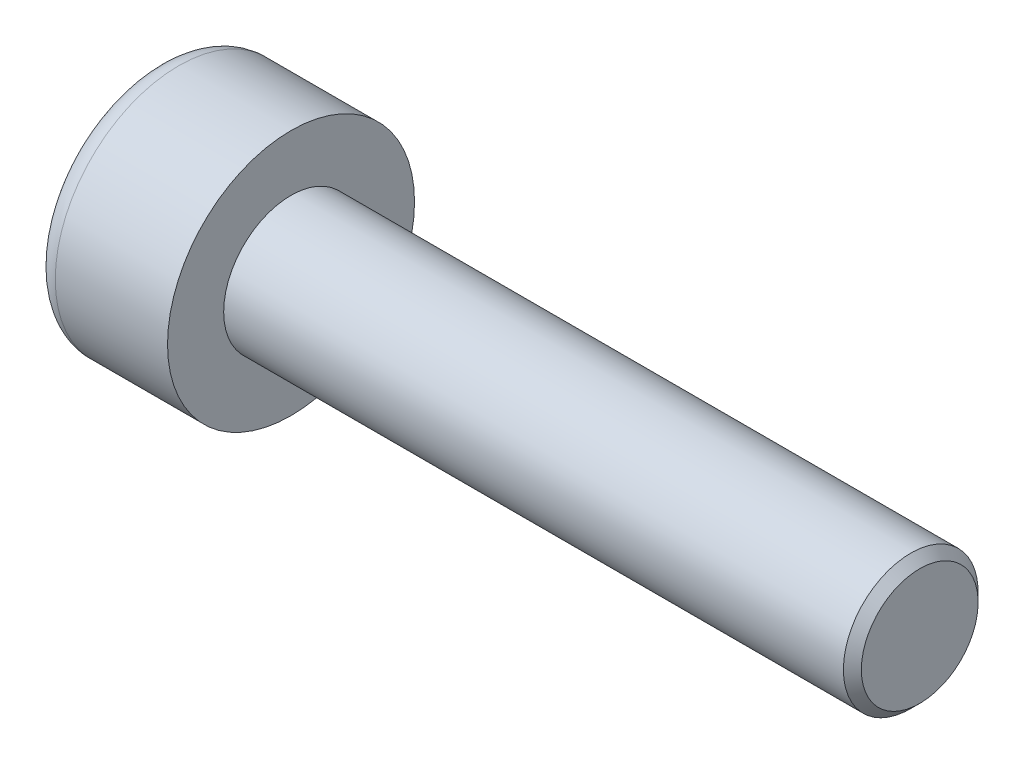
ISO-10303-21;
HEADER;
FILE_DESCRIPTION(('STEP AP214'),'2;1');
FILE_NAME('part.step','',(''),(''),'','','');
FILE_SCHEMA(('AUTOMOTIVE_DESIGN { 1 0 10303 214 1 1 1 1 }'));
ENDSEC;
DATA;
#1=APPLICATION_CONTEXT('core data for automotive mechanical design processes');
#2=APPLICATION_PROTOCOL_DEFINITION('international standard','automotive_design',2000,#1);
#3=PRODUCT_CONTEXT('',#1,'mechanical');
#4=PRODUCT('Part','Part','',(#3));
#5=PRODUCT_RELATED_PRODUCT_CATEGORY('part','',(#4));
#6=PRODUCT_DEFINITION_FORMATION('','',#4);
#7=PRODUCT_DEFINITION_CONTEXT('part definition',#1,'design');
#8=PRODUCT_DEFINITION('design','',#6,#7);
#9=PRODUCT_DEFINITION_SHAPE('','',#8);
#10=(LENGTH_UNIT() NAMED_UNIT(*) SI_UNIT(.MILLI.,.METRE.));
#11=(NAMED_UNIT(*) PLANE_ANGLE_UNIT() SI_UNIT($,.RADIAN.));
#12=(NAMED_UNIT(*) SI_UNIT($,.STERADIAN.) SOLID_ANGLE_UNIT());
#13=UNCERTAINTY_MEASURE_WITH_UNIT(LENGTH_MEASURE(1.E-05),#10,'distance_accuracy_value','');
#14=(GEOMETRIC_REPRESENTATION_CONTEXT(3) GLOBAL_UNCERTAINTY_ASSIGNED_CONTEXT((#13)) GLOBAL_UNIT_ASSIGNED_CONTEXT((#10,
#11,#12)) REPRESENTATION_CONTEXT('',''));
#15=CARTESIAN_POINT('',(0.,0.,0.));
#16=DIRECTION('',(0.,0.,1.));
#17=DIRECTION('',(1.,0.,0.));
#18=AXIS2_PLACEMENT_3D('',#15,#16,#17);
#19=CARTESIAN_POINT('',(0.,0.,0.));
#20=DIRECTION('',(1.,0.,0.));
#21=DIRECTION('',(0.,0.,-1.));
#22=AXIS2_PLACEMENT_3D('',#19,#20,#21);
#23=PLANE('',#22);
#24=DIRECTION('',(0.,0.866025403784439,0.5));
#25=VECTOR('',#24,1.);
#26=CARTESIAN_POINT('',(0.,-1.25,0.721687836487032));
#27=LINE('',#26,#25);
#28=CARTESIAN_POINT('',(0.,-1.25,0.721687836487032));
#29=VERTEX_POINT('',#28);
#30=CARTESIAN_POINT('',(0.,0.,1.44337567297406));
#31=VERTEX_POINT('',#30);
#32=EDGE_CURVE('E91',#29,#31,#27,.T.);
#33=ORIENTED_EDGE('',*,*,#32,.F.);
#34=DIRECTION('',(0.,0.,1.));
#35=VECTOR('',#34,1.);
#36=CARTESIAN_POINT('',(0.,-1.25,-0.721687836487033));
#37=LINE('',#36,#35);
#38=CARTESIAN_POINT('',(0.,-1.25,-0.721687836487033));
#39=VERTEX_POINT('',#38);
#40=EDGE_CURVE('E33',#39,#29,#37,.T.);
#41=ORIENTED_EDGE('',*,*,#40,.F.);
#42=DIRECTION('',(0.,-0.866025403784439,0.5));
#43=VECTOR('',#42,1.);
#44=CARTESIAN_POINT('',(0.,0.,-1.44337567297406));
#45=LINE('',#44,#43);
#46=CARTESIAN_POINT('',(0.,0.,-1.44337567297406));
#47=VERTEX_POINT('',#46);
#48=EDGE_CURVE('E106',#47,#39,#45,.T.);
#49=ORIENTED_EDGE('',*,*,#48,.F.);
#50=DIRECTION('',(0.,-0.866025403784439,-0.5));
#51=VECTOR('',#50,1.);
#52=CARTESIAN_POINT('',(0.,1.25,-0.721687836487033));
#53=LINE('',#52,#51);
#54=CARTESIAN_POINT('',(0.,1.25,-0.721687836487033));
#55=VERTEX_POINT('',#54);
#56=EDGE_CURVE('E100',#55,#47,#53,.T.);
#57=ORIENTED_EDGE('',*,*,#56,.F.);
#58=DIRECTION('',(0.,0.,-1.));
#59=VECTOR('',#58,1.);
#60=CARTESIAN_POINT('',(0.,1.25,0.721687836487032));
#61=LINE('',#60,#59);
#62=CARTESIAN_POINT('',(0.,1.25,0.721687836487032));
#63=VERTEX_POINT('',#62);
#64=EDGE_CURVE('E98',#63,#55,#61,.T.);
#65=ORIENTED_EDGE('',*,*,#64,.F.);
#66=DIRECTION('',(0.,0.866025403784439,-0.5));
#67=VECTOR('',#66,1.);
#68=CARTESIAN_POINT('',(0.,0.,1.44337567297406));
#69=LINE('',#68,#67);
#70=EDGE_CURVE('E84',#31,#63,#69,.T.);
#71=ORIENTED_EDGE('',*,*,#70,.F.);
#72=EDGE_LOOP('',(#33,#41,#49,#57,#65,#71));
#73=FACE_BOUND('',#72,.T.);
#74=CARTESIAN_POINT('',(0.,0.,0.));
#75=DIRECTION('',(-1.,0.,0.));
#76=DIRECTION('',(0.,0.,1.));
#77=AXIS2_PLACEMENT_3D('',#74,#75,#76);
#78=CIRCLE('',#77,2.25);
#79=CARTESIAN_POINT('',(0.,0.,2.25));
#80=VERTEX_POINT('',#79);
#81=EDGE_CURVE('E12',#80,#80,#78,.T.);
#82=ORIENTED_EDGE('',*,*,#81,.T.);
#83=EDGE_LOOP('',(#82));
#84=FACE_BOUND('',#83,.T.);
#85=ADVANCED_FACE('F19',(#73,#84),#23,.F.);
#86=CARTESIAN_POINT('',(0.5,0.,0.));
#87=DIRECTION('',(-1.,0.,0.));
#88=DIRECTION('',(0.,0.,1.));
#89=AXIS2_PLACEMENT_3D('',#86,#87,#88);
#90=TOROIDAL_SURFACE('',#89,2.25,0.5);
#91=ORIENTED_EDGE('',*,*,#81,.F.);
#92=EDGE_LOOP('',(#91));
#93=FACE_BOUND('',#92,.T.);
#94=CARTESIAN_POINT('',(0.5,0.,0.));
#95=DIRECTION('',(-1.,0.,0.));
#96=DIRECTION('',(0.,0.,1.));
#97=AXIS2_PLACEMENT_3D('',#94,#95,#96);
#98=CIRCLE('',#97,2.75);
#99=CARTESIAN_POINT('',(0.5,0.,2.75));
#100=VERTEX_POINT('',#99);
#101=EDGE_CURVE('E26',#100,#100,#98,.T.);
#102=ORIENTED_EDGE('',*,*,#101,.T.);
#103=EDGE_LOOP('',(#102));
#104=FACE_BOUND('',#103,.T.);
#105=ADVANCED_FACE('F132',(#93,#104),#90,.T.);
#106=CARTESIAN_POINT('',(0.,0.,0.));
#107=DIRECTION('',(-1.,0.,0.));
#108=DIRECTION('',(0.,0.,1.));
#109=AXIS2_PLACEMENT_3D('',#106,#107,#108);
#110=CYLINDRICAL_SURFACE('',#109,2.75);
#111=ORIENTED_EDGE('',*,*,#101,.F.);
#112=EDGE_LOOP('',(#111));
#113=FACE_BOUND('',#112,.T.);
#114=CARTESIAN_POINT('',(3.,0.,0.));
#115=DIRECTION('',(-1.,0.,0.));
#116=DIRECTION('',(0.,0.,1.));
#117=AXIS2_PLACEMENT_3D('',#114,#115,#116);
#118=CIRCLE('',#117,2.75);
#119=CARTESIAN_POINT('',(3.,0.,2.75));
#120=VERTEX_POINT('',#119);
#121=EDGE_CURVE('E127',#120,#120,#118,.T.);
#122=ORIENTED_EDGE('',*,*,#121,.T.);
#123=EDGE_LOOP('',(#122));
#124=FACE_BOUND('',#123,.T.);
#125=ADVANCED_FACE('F134',(#113,#124),#110,.T.);
#126=CARTESIAN_POINT('',(3.,2.75,0.));
#127=DIRECTION('',(-1.,0.,0.));
#128=DIRECTION('',(0.,0.,1.));
#129=AXIS2_PLACEMENT_3D('',#126,#127,#128);
#130=PLANE('',#129);
#131=ORIENTED_EDGE('',*,*,#121,.F.);
#132=EDGE_LOOP('',(#131));
#133=FACE_BOUND('',#132,.T.);
#134=CARTESIAN_POINT('',(3.,0.,0.));
#135=DIRECTION('',(-1.,0.,0.));
#136=DIRECTION('',(0.,0.,1.));
#137=AXIS2_PLACEMENT_3D('',#134,#135,#136);
#138=CIRCLE('',#137,1.5);
#139=CARTESIAN_POINT('',(3.,0.,1.5));
#140=VERTEX_POINT('',#139);
#141=EDGE_CURVE('E124',#140,#140,#138,.T.);
#142=ORIENTED_EDGE('',*,*,#141,.T.);
#143=EDGE_LOOP('',(#142));
#144=FACE_BOUND('',#143,.T.);
#145=ADVANCED_FACE('F137',(#133,#144),#130,.F.);
#146=CARTESIAN_POINT('',(0.,0.,0.));
#147=DIRECTION('',(-1.,0.,0.));
#148=DIRECTION('',(0.,0.,1.));
#149=AXIS2_PLACEMENT_3D('',#146,#147,#148);
#150=CYLINDRICAL_SURFACE('',#149,1.5);
#151=ORIENTED_EDGE('',*,*,#141,.F.);
#152=EDGE_LOOP('',(#151));
#153=FACE_BOUND('',#152,.T.);
#154=CARTESIAN_POINT('',(16.8,0.,0.));
#155=DIRECTION('',(-1.,0.,0.));
#156=DIRECTION('',(0.,0.,1.));
#157=AXIS2_PLACEMENT_3D('',#154,#155,#156);
#158=CIRCLE('',#157,1.5);
#159=CARTESIAN_POINT('',(16.8,0.,1.5));
#160=VERTEX_POINT('',#159);
#161=EDGE_CURVE('E121',#160,#160,#158,.T.);
#162=ORIENTED_EDGE('',*,*,#161,.T.);
#163=EDGE_LOOP('',(#162));
#164=FACE_BOUND('',#163,.T.);
#165=ADVANCED_FACE('F143',(#153,#164),#150,.T.);
#166=CARTESIAN_POINT('',(17.,0.,0.));
#167=DIRECTION('',(-1.,0.,0.));
#168=DIRECTION('',(0.,0.,1.));
#169=AXIS2_PLACEMENT_3D('',#166,#167,#168);
#170=CONICAL_SURFACE('',#169,1.3,0.785398163397452);
#171=ORIENTED_EDGE('',*,*,#161,.F.);
#172=EDGE_LOOP('',(#171));
#173=FACE_BOUND('',#172,.T.);
#174=CARTESIAN_POINT('',(17.,0.,0.));
#175=DIRECTION('',(-1.,0.,0.));
#176=DIRECTION('',(0.,0.,1.));
#177=AXIS2_PLACEMENT_3D('',#174,#175,#176);
#178=CIRCLE('',#177,1.3);
#179=CARTESIAN_POINT('',(17.,0.,1.3));
#180=VERTEX_POINT('',#179);
#181=EDGE_CURVE('E118',#180,#180,#178,.T.);
#182=ORIENTED_EDGE('',*,*,#181,.T.);
#183=EDGE_LOOP('',(#182));
#184=FACE_BOUND('',#183,.T.);
#185=ADVANCED_FACE('F149',(#173,#184),#170,.T.);
#186=CARTESIAN_POINT('',(17.,1.3,0.));
#187=DIRECTION('',(-1.,0.,0.));
#188=DIRECTION('',(0.,0.,1.));
#189=AXIS2_PLACEMENT_3D('',#186,#187,#188);
#190=PLANE('',#189);
#191=ORIENTED_EDGE('',*,*,#181,.F.);
#192=EDGE_LOOP('',(#191));
#193=FACE_BOUND('',#192,.T.);
#194=ADVANCED_FACE('F155',(#193),#190,.F.);
#195=CARTESIAN_POINT('',(6.81881307912987,-1.25,-0.721687836487033));
#196=DIRECTION('',(0.,-1.,0.));
#197=DIRECTION('',(0.,0.,-1.));
#198=AXIS2_PLACEMENT_3D('',#195,#196,#197);
#199=PLANE('',#198);
#200=DIRECTION('',(0.,0.,-1.));
#201=VECTOR('',#200,1.);
#202=CARTESIAN_POINT('',(2.5,-1.25,-0.721687836487033));
#203=LINE('',#202,#201);
#204=CARTESIAN_POINT('',(2.5,-1.25,0.721687836487032));
#205=VERTEX_POINT('',#204);
#206=CARTESIAN_POINT('',(2.5,-1.25,-0.721687836487033));
#207=VERTEX_POINT('',#206);
#208=EDGE_CURVE('E52',#205,#207,#203,.T.);
#209=ORIENTED_EDGE('',*,*,#208,.T.);
#210=DIRECTION('',(-1.,0.,0.));
#211=VECTOR('',#210,1.);
#212=CARTESIAN_POINT('',(6.81881307912987,-1.25,-0.721687836487033));
#213=LINE('',#212,#211);
#214=EDGE_CURVE('E109',#207,#39,#213,.T.);
#215=ORIENTED_EDGE('',*,*,#214,.T.);
#216=ORIENTED_EDGE('',*,*,#40,.T.);
#217=DIRECTION('',(-1.,0.,0.));
#218=VECTOR('',#217,1.);
#219=CARTESIAN_POINT('',(6.81881307912987,-1.25,0.721687836487032));
#220=LINE('',#219,#218);
#221=EDGE_CURVE('E88',#205,#29,#220,.T.);
#222=ORIENTED_EDGE('',*,*,#221,.F.);
#223=EDGE_LOOP('',(#209,#215,#216,#222));
#224=FACE_BOUND('',#223,.T.);
#225=ADVANCED_FACE('F160',(#224),#199,.F.);
#226=CARTESIAN_POINT('',(6.81881307912987,0.,-1.44337567297406));
#227=DIRECTION('',(0.,-0.5,-0.866025403784439));
#228=DIRECTION('',(0.,0.866025403784439,-0.5));
#229=AXIS2_PLACEMENT_3D('',#226,#227,#228);
#230=PLANE('',#229);
#231=DIRECTION('',(0.,0.866025403784439,-0.5));
#232=VECTOR('',#231,1.);
#233=CARTESIAN_POINT('',(2.5,0.,-1.44337567297406));
#234=LINE('',#233,#232);
#235=CARTESIAN_POINT('',(2.5,0.,-1.44337567297406));
#236=VERTEX_POINT('',#235);
#237=EDGE_CURVE('E280',#207,#236,#234,.T.);
#238=ORIENTED_EDGE('',*,*,#237,.T.);
#239=DIRECTION('',(-1.,0.,0.));
#240=VECTOR('',#239,1.);
#241=CARTESIAN_POINT('',(6.81881307912987,0.,-1.44337567297406));
#242=LINE('',#241,#240);
#243=EDGE_CURVE('E111',#236,#47,#242,.T.);
#244=ORIENTED_EDGE('',*,*,#243,.T.);
#245=ORIENTED_EDGE('',*,*,#48,.T.);
#246=ORIENTED_EDGE('',*,*,#214,.F.);
#247=EDGE_LOOP('',(#238,#244,#245,#246));
#248=FACE_BOUND('',#247,.T.);
#249=ADVANCED_FACE('F167',(#248),#230,.F.);
#250=CARTESIAN_POINT('',(6.81881307912987,1.25,-0.721687836487033));
#251=DIRECTION('',(0.,0.5,-0.866025403784439));
#252=DIRECTION('',(0.,0.866025403784439,0.5));
#253=AXIS2_PLACEMENT_3D('',#250,#251,#252);
#254=PLANE('',#253);
#255=DIRECTION('',(0.,0.866025403784439,0.5));
#256=VECTOR('',#255,1.);
#257=CARTESIAN_POINT('',(2.5,1.25,-0.721687836487033));
#258=LINE('',#257,#256);
#259=CARTESIAN_POINT('',(2.5,1.25,-0.721687836487033));
#260=VERTEX_POINT('',#259);
#261=EDGE_CURVE('E283',#236,#260,#258,.T.);
#262=ORIENTED_EDGE('',*,*,#261,.T.);
#263=DIRECTION('',(-1.,0.,0.));
#264=VECTOR('',#263,1.);
#265=CARTESIAN_POINT('',(6.81881307912987,1.25,-0.721687836487033));
#266=LINE('',#265,#264);
#267=EDGE_CURVE('E113',#260,#55,#266,.T.);
#268=ORIENTED_EDGE('',*,*,#267,.T.);
#269=ORIENTED_EDGE('',*,*,#56,.T.);
#270=ORIENTED_EDGE('',*,*,#243,.F.);
#271=EDGE_LOOP('',(#262,#268,#269,#270));
#272=FACE_BOUND('',#271,.T.);
#273=ADVANCED_FACE('F231',(#272),#254,.F.);
#274=CARTESIAN_POINT('',(6.81881307912987,1.25,0.721687836487032));
#275=DIRECTION('',(0.,1.,0.));
#276=DIRECTION('',(0.,0.,1.));
#277=AXIS2_PLACEMENT_3D('',#274,#275,#276);
#278=PLANE('',#277);
#279=DIRECTION('',(0.,0.,1.));
#280=VECTOR('',#279,1.);
#281=CARTESIAN_POINT('',(2.5,1.25,0.721687836487032));
#282=LINE('',#281,#280);
#283=CARTESIAN_POINT('',(2.5,1.25,0.721687836487032));
#284=VERTEX_POINT('',#283);
#285=EDGE_CURVE('E42',#260,#284,#282,.T.);
#286=ORIENTED_EDGE('',*,*,#285,.T.);
#287=DIRECTION('',(-1.,0.,0.));
#288=VECTOR('',#287,1.);
#289=CARTESIAN_POINT('',(6.81881307912987,1.25,0.721687836487032));
#290=LINE('',#289,#288);
#291=EDGE_CURVE('E87',#284,#63,#290,.T.);
#292=ORIENTED_EDGE('',*,*,#291,.T.);
#293=ORIENTED_EDGE('',*,*,#64,.T.);
#294=ORIENTED_EDGE('',*,*,#267,.F.);
#295=EDGE_LOOP('',(#286,#292,#293,#294));
#296=FACE_BOUND('',#295,.T.);
#297=ADVANCED_FACE('F239',(#296),#278,.F.);
#298=CARTESIAN_POINT('',(6.81881307912987,0.,1.44337567297406));
#299=DIRECTION('',(0.,0.5,0.866025403784439));
#300=DIRECTION('',(0.,-0.866025403784439,0.5));
#301=AXIS2_PLACEMENT_3D('',#298,#299,#300);
#302=PLANE('',#301);
#303=DIRECTION('',(0.,-0.866025403784439,0.5));
#304=VECTOR('',#303,1.);
#305=CARTESIAN_POINT('',(2.5,0.,1.44337567297406));
#306=LINE('',#305,#304);
#307=CARTESIAN_POINT('',(2.5,0.,1.44337567297406));
#308=VERTEX_POINT('',#307);
#309=EDGE_CURVE('E86',#284,#308,#306,.T.);
#310=ORIENTED_EDGE('',*,*,#309,.T.);
#311=DIRECTION('',(-1.,0.,0.));
#312=VECTOR('',#311,1.);
#313=CARTESIAN_POINT('',(6.81881307912987,0.,1.44337567297406));
#314=LINE('',#313,#312);
#315=EDGE_CURVE('E79',#308,#31,#314,.T.);
#316=ORIENTED_EDGE('',*,*,#315,.T.);
#317=ORIENTED_EDGE('',*,*,#70,.T.);
#318=ORIENTED_EDGE('',*,*,#291,.F.);
#319=EDGE_LOOP('',(#310,#316,#317,#318));
#320=FACE_BOUND('',#319,.T.);
#321=ADVANCED_FACE('F81',(#320),#302,.F.);
#322=CARTESIAN_POINT('',(6.81881307912987,-1.25,0.721687836487032));
#323=DIRECTION('',(0.,-0.5,0.866025403784439));
#324=DIRECTION('',(0.,-0.866025403784439,-0.5));
#325=AXIS2_PLACEMENT_3D('',#322,#323,#324);
#326=PLANE('',#325);
#327=DIRECTION('',(0.,-0.866025403784439,-0.5));
#328=VECTOR('',#327,1.);
#329=CARTESIAN_POINT('',(2.5,-1.25,0.721687836487032));
#330=LINE('',#329,#328);
#331=EDGE_CURVE('E61',#308,#205,#330,.T.);
#332=ORIENTED_EDGE('',*,*,#331,.T.);
#333=ORIENTED_EDGE('',*,*,#221,.T.);
#334=ORIENTED_EDGE('',*,*,#32,.T.);
#335=ORIENTED_EDGE('',*,*,#315,.F.);
#336=EDGE_LOOP('',(#332,#333,#334,#335));
#337=FACE_BOUND('',#336,.T.);
#338=ADVANCED_FACE('F92',(#337),#326,.F.);
#339=CARTESIAN_POINT('',(2.5,2.75,0.));
#340=DIRECTION('',(-1.,0.,0.));
#341=DIRECTION('',(0.,0.,1.));
#342=AXIS2_PLACEMENT_3D('',#339,#340,#341);
#343=PLANE('',#342);
#344=ORIENTED_EDGE('',*,*,#208,.F.);
#345=ORIENTED_EDGE('',*,*,#331,.F.);
#346=ORIENTED_EDGE('',*,*,#309,.F.);
#347=ORIENTED_EDGE('',*,*,#285,.F.);
#348=ORIENTED_EDGE('',*,*,#261,.F.);
#349=ORIENTED_EDGE('',*,*,#237,.F.);
#350=EDGE_LOOP('',(#344,#345,#346,#347,#348,#349));
#351=FACE_BOUND('',#350,.T.);
#352=ADVANCED_FACE('F262',(#351),#343,.T.);
#353=CLOSED_SHELL('',(#85,#105,#125,#145,#165,#185,#194,#225,#249,#273,#297,#321,#338,#352));
#354=MANIFOLD_SOLID_BREP('B1',#353);
#355=ADVANCED_BREP_SHAPE_REPRESENTATION('',(#18,#354),#14);
#356=SHAPE_DEFINITION_REPRESENTATION(#9,#355);
ENDSEC;
END-ISO-10303-21;
